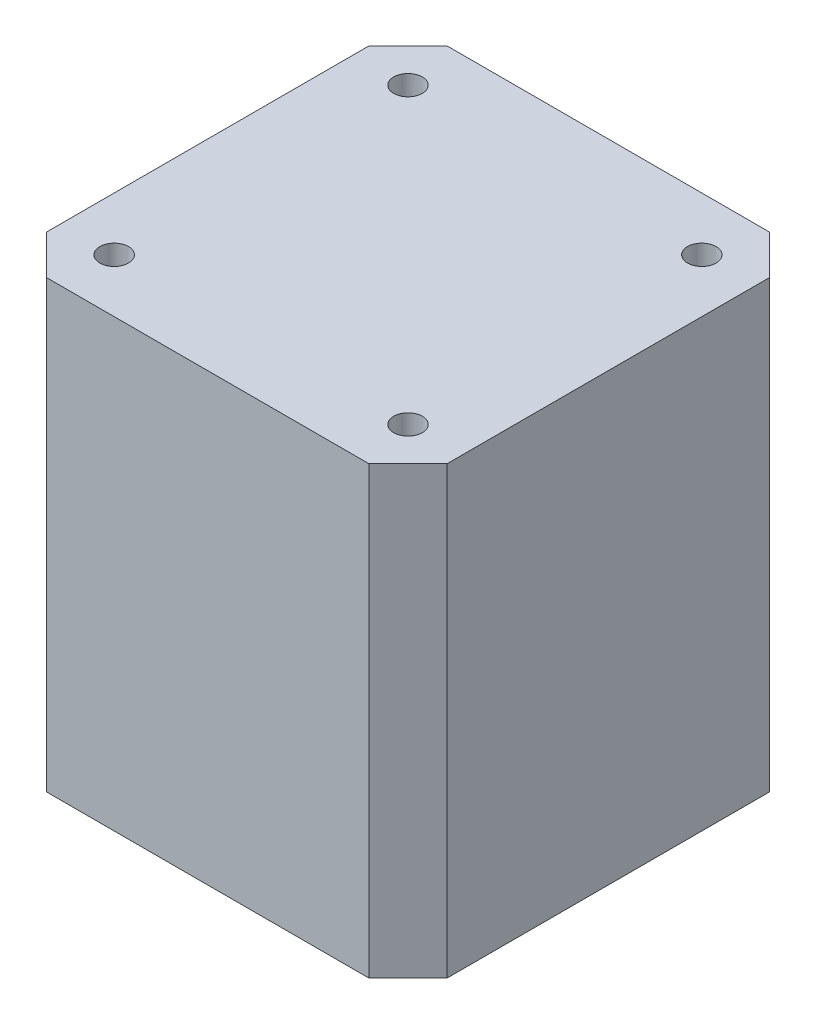
ISO-10303-21;
HEADER;
FILE_DESCRIPTION(('STEP AP214'),'2;1');
FILE_NAME('part.step','',(''),(''),'','','');
FILE_SCHEMA(('AUTOMOTIVE_DESIGN { 1 0 10303 214 1 1 1 1 }'));
ENDSEC;
DATA;
#1=APPLICATION_CONTEXT('core data for automotive mechanical design processes');
#2=APPLICATION_PROTOCOL_DEFINITION('international standard','automotive_design',2000,#1);
#3=PRODUCT_CONTEXT('',#1,'mechanical');
#4=PRODUCT('Part','Part','',(#3));
#5=PRODUCT_RELATED_PRODUCT_CATEGORY('part','',(#4));
#6=PRODUCT_DEFINITION_FORMATION('','',#4);
#7=PRODUCT_DEFINITION_CONTEXT('part definition',#1,'design');
#8=PRODUCT_DEFINITION('design','',#6,#7);
#9=PRODUCT_DEFINITION_SHAPE('','',#8);
#10=(LENGTH_UNIT() NAMED_UNIT(*) SI_UNIT(.MILLI.,.METRE.));
#11=(NAMED_UNIT(*) PLANE_ANGLE_UNIT() SI_UNIT($,.RADIAN.));
#12=(NAMED_UNIT(*) SI_UNIT($,.STERADIAN.) SOLID_ANGLE_UNIT());
#13=UNCERTAINTY_MEASURE_WITH_UNIT(LENGTH_MEASURE(1.E-05),#10,'distance_accuracy_value','');
#14=(GEOMETRIC_REPRESENTATION_CONTEXT(3) GLOBAL_UNCERTAINTY_ASSIGNED_CONTEXT((#13)) GLOBAL_UNIT_ASSIGNED_CONTEXT((#10,
#11,#12)) REPRESENTATION_CONTEXT('',''));
#15=CARTESIAN_POINT('',(0.,0.,0.));
#16=DIRECTION('',(0.,0.,1.));
#17=DIRECTION('',(1.,0.,0.));
#18=AXIS2_PLACEMENT_3D('',#15,#16,#17);
#19=CARTESIAN_POINT('',(0.,47.,0.));
#20=DIRECTION('',(0.,-1.,0.));
#21=DIRECTION('',(0.,0.,-1.));
#22=AXIS2_PLACEMENT_3D('',#19,#20,#21);
#23=PLANE('',#22);
#24=DIRECTION('',(0.707106781186548,0.,0.707106781186548));
#25=VECTOR('',#24,1.);
#26=CARTESIAN_POINT('',(-21.1500000000002,47.,17.0100000000009));
#27=LINE('',#26,#25);
#28=CARTESIAN_POINT('',(-21.1500000000002,47.,17.0100000000009));
#29=VERTEX_POINT('',#28);
#30=CARTESIAN_POINT('',(-17.0099999999998,47.,21.1500000000013));
#31=VERTEX_POINT('',#30);
#32=EDGE_CURVE('E146',#29,#31,#27,.T.);
#33=ORIENTED_EDGE('',*,*,#32,.T.);
#34=DIRECTION('',(1.,0.,0.));
#35=VECTOR('',#34,1.);
#36=CARTESIAN_POINT('',(-17.0099999999998,47.,21.1500000000013));
#37=LINE('',#36,#35);
#38=CARTESIAN_POINT('',(17.0099999999998,47.,21.1500000000013));
#39=VERTEX_POINT('',#38);
#40=EDGE_CURVE('E94',#31,#39,#37,.T.);
#41=ORIENTED_EDGE('',*,*,#40,.T.);
#42=DIRECTION('',(0.707106781186547,0.,-0.707106781186547));
#43=VECTOR('',#42,1.);
#44=CARTESIAN_POINT('',(21.1500000000002,47.,17.0100000000009));
#45=LINE('',#44,#43);
#46=CARTESIAN_POINT('',(21.1500000000002,47.,17.0100000000009));
#47=VERTEX_POINT('',#46);
#48=EDGE_CURVE('E225',#39,#47,#45,.T.);
#49=ORIENTED_EDGE('',*,*,#48,.T.);
#50=DIRECTION('',(0.,0.,-1.));
#51=VECTOR('',#50,1.);
#52=CARTESIAN_POINT('',(21.1500000000002,47.,17.0100000000009));
#53=LINE('',#52,#51);
#54=CARTESIAN_POINT('',(21.1500000000002,47.,-17.0099999999987));
#55=VERTEX_POINT('',#54);
#56=EDGE_CURVE('E227',#47,#55,#53,.T.);
#57=ORIENTED_EDGE('',*,*,#56,.T.);
#58=DIRECTION('',(-0.707106781186547,0.,-0.707106781186548));
#59=VECTOR('',#58,1.);
#60=CARTESIAN_POINT('',(17.0099999999998,47.,-21.1499999999992));
#61=LINE('',#60,#59);
#62=CARTESIAN_POINT('',(17.0099999999998,47.,-21.1499999999992));
#63=VERTEX_POINT('',#62);
#64=EDGE_CURVE('E113',#55,#63,#61,.T.);
#65=ORIENTED_EDGE('',*,*,#64,.T.);
#66=DIRECTION('',(-1.,0.,0.));
#67=VECTOR('',#66,1.);
#68=CARTESIAN_POINT('',(-17.01,47.,-21.1499999999992));
#69=LINE('',#68,#67);
#70=CARTESIAN_POINT('',(-17.01,47.,-21.1499999999992));
#71=VERTEX_POINT('',#70);
#72=EDGE_CURVE('E107',#63,#71,#69,.T.);
#73=ORIENTED_EDGE('',*,*,#72,.T.);
#74=DIRECTION('',(-0.707106781186566,0.,0.707106781186529));
#75=VECTOR('',#74,1.);
#76=CARTESIAN_POINT('',(-17.01,47.,-21.1499999999992));
#77=LINE('',#76,#75);
#78=CARTESIAN_POINT('',(-21.1500000000002,47.,-17.0099999999991));
#79=VERTEX_POINT('',#78);
#80=EDGE_CURVE('E111',#71,#79,#77,.T.);
#81=ORIENTED_EDGE('',*,*,#80,.T.);
#82=DIRECTION('',(0.,0.,1.));
#83=VECTOR('',#82,1.);
#84=CARTESIAN_POINT('',(-21.1500000000002,47.,17.0100000000009));
#85=LINE('',#84,#83);
#86=EDGE_CURVE('E50',#79,#29,#85,.T.);
#87=ORIENTED_EDGE('',*,*,#86,.T.);
#88=EDGE_LOOP('',(#33,#41,#49,#57,#65,#73,#81,#87));
#89=FACE_BOUND('',#88,.T.);
#90=CARTESIAN_POINT('',(15.5,47.,-15.5));
#91=DIRECTION('',(0.,1.,0.));
#92=DIRECTION('',(0.,0.,1.));
#93=AXIS2_PLACEMENT_3D('',#90,#91,#92);
#94=CIRCLE('',#93,1.51);
#95=CARTESIAN_POINT('',(15.5,47.,-13.99));
#96=VERTEX_POINT('',#95);
#97=EDGE_CURVE('E135',#96,#96,#94,.T.);
#98=ORIENTED_EDGE('',*,*,#97,.F.);
#99=EDGE_LOOP('',(#98));
#100=FACE_BOUND('',#99,.T.);
#101=CARTESIAN_POINT('',(15.5000000000009,47.,15.5));
#102=DIRECTION('',(0.,1.,0.));
#103=DIRECTION('',(0.,0.,1.));
#104=AXIS2_PLACEMENT_3D('',#101,#102,#103);
#105=CIRCLE('',#104,1.50999999999979);
#106=CARTESIAN_POINT('',(15.5000000000009,47.,17.0099999999998));
#107=VERTEX_POINT('',#106);
#108=EDGE_CURVE('E236',#107,#107,#105,.T.);
#109=ORIENTED_EDGE('',*,*,#108,.F.);
#110=EDGE_LOOP('',(#109));
#111=FACE_BOUND('',#110,.T.);
#112=CARTESIAN_POINT('',(-15.4999999999991,47.,15.5000000000009));
#113=DIRECTION('',(0.,1.,0.));
#114=DIRECTION('',(0.,0.,1.));
#115=AXIS2_PLACEMENT_3D('',#112,#113,#114);
#116=CIRCLE('',#115,1.51000000000065);
#117=CARTESIAN_POINT('',(-15.4999999999991,47.,17.0100000000015));
#118=VERTEX_POINT('',#117);
#119=EDGE_CURVE('E242',#118,#118,#116,.T.);
#120=ORIENTED_EDGE('',*,*,#119,.F.);
#121=EDGE_LOOP('',(#120));
#122=FACE_BOUND('',#121,.T.);
#123=CARTESIAN_POINT('',(-15.5,47.,-15.4999999999991));
#124=DIRECTION('',(0.,1.,0.));
#125=DIRECTION('',(0.,0.,1.));
#126=AXIS2_PLACEMENT_3D('',#123,#124,#125);
#127=CIRCLE('',#126,1.51000000000094);
#128=CARTESIAN_POINT('',(-15.5,47.,-13.9899999999982));
#129=VERTEX_POINT('',#128);
#130=EDGE_CURVE('E248',#129,#129,#127,.T.);
#131=ORIENTED_EDGE('',*,*,#130,.F.);
#132=EDGE_LOOP('',(#131));
#133=FACE_BOUND('',#132,.T.);
#134=ADVANCED_FACE('F33',(#89,#100,#111,#122,#133),#23,.F.);
#135=CARTESIAN_POINT('',(0.,0.,0.));
#136=DIRECTION('',(0.,-1.,0.));
#137=DIRECTION('',(0.,0.,-1.));
#138=AXIS2_PLACEMENT_3D('',#135,#136,#137);
#139=PLANE('',#138);
#140=CARTESIAN_POINT('',(0.,0.,0.));
#141=DIRECTION('',(0.,-1.,0.));
#142=DIRECTION('',(0.,0.,-1.));
#143=AXIS2_PLACEMENT_3D('',#140,#141,#142);
#144=CIRCLE('',#143,2.475);
#145=CARTESIAN_POINT('',(0.,0.,-2.475));
#146=VERTEX_POINT('',#145);
#147=EDGE_CURVE('E161',#146,#146,#144,.T.);
#148=ORIENTED_EDGE('',*,*,#147,.F.);
#149=EDGE_LOOP('',(#148));
#150=FACE_BOUND('',#149,.T.);
#151=CARTESIAN_POINT('',(-15.4999999999991,0.,15.5000000000009));
#152=DIRECTION('',(0.,1.,0.));
#153=DIRECTION('',(0.,0.,1.));
#154=AXIS2_PLACEMENT_3D('',#151,#152,#153);
#155=CIRCLE('',#154,1.51000000000065);
#156=CARTESIAN_POINT('',(-15.4999999999991,0.,17.0100000000015));
#157=VERTEX_POINT('',#156);
#158=EDGE_CURVE('E245',#157,#157,#155,.T.);
#159=ORIENTED_EDGE('',*,*,#158,.T.);
#160=EDGE_LOOP('',(#159));
#161=FACE_BOUND('',#160,.T.);
#162=CARTESIAN_POINT('',(15.5,0.,-15.5));
#163=DIRECTION('',(0.,1.,0.));
#164=DIRECTION('',(0.,0.,1.));
#165=AXIS2_PLACEMENT_3D('',#162,#163,#164);
#166=CIRCLE('',#165,1.51);
#167=CARTESIAN_POINT('',(15.5,0.,-13.99));
#168=VERTEX_POINT('',#167);
#169=EDGE_CURVE('E233',#168,#168,#166,.T.);
#170=ORIENTED_EDGE('',*,*,#169,.T.);
#171=EDGE_LOOP('',(#170));
#172=FACE_BOUND('',#171,.T.);
#173=DIRECTION('',(0.707106781186548,0.,0.707106781186548));
#174=VECTOR('',#173,1.);
#175=CARTESIAN_POINT('',(-21.1500000000002,0.,17.0100000000009));
#176=LINE('',#175,#174);
#177=CARTESIAN_POINT('',(-21.1500000000002,0.,17.0100000000009));
#178=VERTEX_POINT('',#177);
#179=CARTESIAN_POINT('',(-17.0099999999998,0.,21.1500000000013));
#180=VERTEX_POINT('',#179);
#181=EDGE_CURVE('E131',#178,#180,#176,.T.);
#182=ORIENTED_EDGE('',*,*,#181,.F.);
#183=DIRECTION('',(0.,0.,1.));
#184=VECTOR('',#183,1.);
#185=CARTESIAN_POINT('',(-21.1500000000002,0.,17.0100000000009));
#186=LINE('',#185,#184);
#187=CARTESIAN_POINT('',(-21.1500000000002,0.,-17.0099999999991));
#188=VERTEX_POINT('',#187);
#189=EDGE_CURVE('E85',#188,#178,#186,.T.);
#190=ORIENTED_EDGE('',*,*,#189,.F.);
#191=DIRECTION('',(-0.707106781186566,0.,0.707106781186529));
#192=VECTOR('',#191,1.);
#193=CARTESIAN_POINT('',(-17.01,0.,-21.1499999999992));
#194=LINE('',#193,#192);
#195=CARTESIAN_POINT('',(-17.01,0.,-21.1499999999992));
#196=VERTEX_POINT('',#195);
#197=EDGE_CURVE('E79',#196,#188,#194,.T.);
#198=ORIENTED_EDGE('',*,*,#197,.F.);
#199=DIRECTION('',(-1.,0.,0.));
#200=VECTOR('',#199,1.);
#201=CARTESIAN_POINT('',(-17.01,0.,-21.1499999999992));
#202=LINE('',#201,#200);
#203=CARTESIAN_POINT('',(17.0099999999998,0.,-21.1499999999992));
#204=VERTEX_POINT('',#203);
#205=EDGE_CURVE('E121',#204,#196,#202,.T.);
#206=ORIENTED_EDGE('',*,*,#205,.F.);
#207=DIRECTION('',(-0.707106781186547,0.,-0.707106781186548));
#208=VECTOR('',#207,1.);
#209=CARTESIAN_POINT('',(17.0099999999998,0.,-21.1499999999992));
#210=LINE('',#209,#208);
#211=CARTESIAN_POINT('',(21.1500000000002,0.,-17.0099999999987));
#212=VERTEX_POINT('',#211);
#213=EDGE_CURVE('E141',#212,#204,#210,.T.);
#214=ORIENTED_EDGE('',*,*,#213,.F.);
#215=DIRECTION('',(0.,0.,-1.));
#216=VECTOR('',#215,1.);
#217=CARTESIAN_POINT('',(21.1500000000002,0.,17.0100000000009));
#218=LINE('',#217,#216);
#219=CARTESIAN_POINT('',(21.1500000000002,0.,17.0100000000009));
#220=VERTEX_POINT('',#219);
#221=EDGE_CURVE('E139',#220,#212,#218,.T.);
#222=ORIENTED_EDGE('',*,*,#221,.F.);
#223=DIRECTION('',(0.707106781186547,0.,-0.707106781186547));
#224=VECTOR('',#223,1.);
#225=CARTESIAN_POINT('',(21.1500000000002,0.,17.0100000000009));
#226=LINE('',#225,#224);
#227=CARTESIAN_POINT('',(17.0099999999998,0.,21.1500000000013));
#228=VERTEX_POINT('',#227);
#229=EDGE_CURVE('E137',#228,#220,#226,.T.);
#230=ORIENTED_EDGE('',*,*,#229,.F.);
#231=DIRECTION('',(1.,0.,0.));
#232=VECTOR('',#231,1.);
#233=CARTESIAN_POINT('',(-17.0099999999998,0.,21.1500000000013));
#234=LINE('',#233,#232);
#235=EDGE_CURVE('E134',#180,#228,#234,.T.);
#236=ORIENTED_EDGE('',*,*,#235,.F.);
#237=EDGE_LOOP('',(#182,#190,#198,#206,#214,#222,#230,#236));
#238=FACE_BOUND('',#237,.T.);
#239=CARTESIAN_POINT('',(15.5000000000009,0.,15.5));
#240=DIRECTION('',(0.,1.,0.));
#241=DIRECTION('',(0.,0.,1.));
#242=AXIS2_PLACEMENT_3D('',#239,#240,#241);
#243=CIRCLE('',#242,1.50999999999979);
#244=CARTESIAN_POINT('',(15.5000000000009,0.,17.0099999999998));
#245=VERTEX_POINT('',#244);
#246=EDGE_CURVE('E239',#245,#245,#243,.T.);
#247=ORIENTED_EDGE('',*,*,#246,.T.);
#248=EDGE_LOOP('',(#247));
#249=FACE_BOUND('',#248,.T.);
#250=CARTESIAN_POINT('',(-15.5,0.,-15.4999999999991));
#251=DIRECTION('',(0.,1.,0.));
#252=DIRECTION('',(0.,0.,1.));
#253=AXIS2_PLACEMENT_3D('',#250,#251,#252);
#254=CIRCLE('',#253,1.51000000000094);
#255=CARTESIAN_POINT('',(-15.5,0.,-13.9899999999982));
#256=VERTEX_POINT('',#255);
#257=EDGE_CURVE('E251',#256,#256,#254,.T.);
#258=ORIENTED_EDGE('',*,*,#257,.T.);
#259=EDGE_LOOP('',(#258));
#260=FACE_BOUND('',#259,.T.);
#261=ADVANCED_FACE('F179',(#150,#161,#172,#238,#249,#260),#139,.T.);
#262=CARTESIAN_POINT('',(-21.1500000000002,47.,17.0100000000009));
#263=DIRECTION('',(0.707106781186547,0.,-0.707106781186547));
#264=DIRECTION('',(-0.707106781186548,0.,-0.707106781186548));
#265=AXIS2_PLACEMENT_3D('',#262,#263,#264);
#266=PLANE('',#265);
#267=ORIENTED_EDGE('',*,*,#181,.T.);
#268=DIRECTION('',(0.,-1.,0.));
#269=VECTOR('',#268,1.);
#270=CARTESIAN_POINT('',(-17.0099999999998,47.,21.1500000000013));
#271=LINE('',#270,#269);
#272=EDGE_CURVE('E159',#31,#180,#271,.T.);
#273=ORIENTED_EDGE('',*,*,#272,.F.);
#274=ORIENTED_EDGE('',*,*,#32,.F.);
#275=DIRECTION('',(0.,-1.,0.));
#276=VECTOR('',#275,1.);
#277=CARTESIAN_POINT('',(-21.1500000000002,47.,17.0100000000009));
#278=LINE('',#277,#276);
#279=EDGE_CURVE('E127',#29,#178,#278,.T.);
#280=ORIENTED_EDGE('',*,*,#279,.T.);
#281=EDGE_LOOP('',(#267,#273,#274,#280));
#282=FACE_BOUND('',#281,.T.);
#283=ADVANCED_FACE('F184',(#282),#266,.F.);
#284=CARTESIAN_POINT('',(-17.0099999999998,47.,21.1500000000013));
#285=DIRECTION('',(0.,0.,-1.));
#286=DIRECTION('',(-1.,0.,0.));
#287=AXIS2_PLACEMENT_3D('',#284,#285,#286);
#288=PLANE('',#287);
#289=ORIENTED_EDGE('',*,*,#235,.T.);
#290=DIRECTION('',(0.,-1.,0.));
#291=VECTOR('',#290,1.);
#292=CARTESIAN_POINT('',(17.0099999999998,47.,21.1500000000013));
#293=LINE('',#292,#291);
#294=EDGE_CURVE('E156',#39,#228,#293,.T.);
#295=ORIENTED_EDGE('',*,*,#294,.F.);
#296=ORIENTED_EDGE('',*,*,#40,.F.);
#297=ORIENTED_EDGE('',*,*,#272,.T.);
#298=EDGE_LOOP('',(#289,#295,#296,#297));
#299=FACE_BOUND('',#298,.T.);
#300=ADVANCED_FACE('F209',(#299),#288,.F.);
#301=CARTESIAN_POINT('',(21.1500000000002,47.,17.0100000000009));
#302=DIRECTION('',(-0.707106781186547,0.,-0.707106781186547));
#303=DIRECTION('',(-0.707106781186548,0.,0.707106781186548));
#304=AXIS2_PLACEMENT_3D('',#301,#302,#303);
#305=PLANE('',#304);
#306=ORIENTED_EDGE('',*,*,#229,.T.);
#307=DIRECTION('',(0.,-1.,0.));
#308=VECTOR('',#307,1.);
#309=CARTESIAN_POINT('',(21.1500000000002,47.,17.0100000000009));
#310=LINE('',#309,#308);
#311=EDGE_CURVE('E153',#47,#220,#310,.T.);
#312=ORIENTED_EDGE('',*,*,#311,.F.);
#313=ORIENTED_EDGE('',*,*,#48,.F.);
#314=ORIENTED_EDGE('',*,*,#294,.T.);
#315=EDGE_LOOP('',(#306,#312,#313,#314));
#316=FACE_BOUND('',#315,.T.);
#317=ADVANCED_FACE('F205',(#316),#305,.F.);
#318=CARTESIAN_POINT('',(21.1500000000002,47.,17.0100000000009));
#319=DIRECTION('',(-1.,0.,0.));
#320=DIRECTION('',(0.,0.,1.));
#321=AXIS2_PLACEMENT_3D('',#318,#319,#320);
#322=PLANE('',#321);
#323=ORIENTED_EDGE('',*,*,#221,.T.);
#324=DIRECTION('',(0.,-1.,0.));
#325=VECTOR('',#324,1.);
#326=CARTESIAN_POINT('',(21.1500000000002,47.,-17.0099999999987));
#327=LINE('',#326,#325);
#328=EDGE_CURVE('E150',#55,#212,#327,.T.);
#329=ORIENTED_EDGE('',*,*,#328,.F.);
#330=ORIENTED_EDGE('',*,*,#56,.F.);
#331=ORIENTED_EDGE('',*,*,#311,.T.);
#332=EDGE_LOOP('',(#323,#329,#330,#331));
#333=FACE_BOUND('',#332,.T.);
#334=ADVANCED_FACE('F201',(#333),#322,.F.);
#335=CARTESIAN_POINT('',(17.0099999999998,47.,-21.1499999999992));
#336=DIRECTION('',(-0.707106781186548,0.,0.707106781186547));
#337=DIRECTION('',(0.707106781186547,0.,0.707106781186548));
#338=AXIS2_PLACEMENT_3D('',#335,#336,#337);
#339=PLANE('',#338);
#340=ORIENTED_EDGE('',*,*,#213,.T.);
#341=DIRECTION('',(0.,-1.,0.));
#342=VECTOR('',#341,1.);
#343=CARTESIAN_POINT('',(17.0099999999998,47.,-21.1499999999992));
#344=LINE('',#343,#342);
#345=EDGE_CURVE('E122',#63,#204,#344,.T.);
#346=ORIENTED_EDGE('',*,*,#345,.F.);
#347=ORIENTED_EDGE('',*,*,#64,.F.);
#348=ORIENTED_EDGE('',*,*,#328,.T.);
#349=EDGE_LOOP('',(#340,#346,#347,#348));
#350=FACE_BOUND('',#349,.T.);
#351=ADVANCED_FACE('F198',(#350),#339,.F.);
#352=CARTESIAN_POINT('',(-17.01,47.,-21.1499999999992));
#353=DIRECTION('',(0.,0.,1.));
#354=DIRECTION('',(1.,0.,0.));
#355=AXIS2_PLACEMENT_3D('',#352,#353,#354);
#356=PLANE('',#355);
#357=ORIENTED_EDGE('',*,*,#205,.T.);
#358=DIRECTION('',(0.,-1.,0.));
#359=VECTOR('',#358,1.);
#360=CARTESIAN_POINT('',(-17.01,47.,-21.1499999999992));
#361=LINE('',#360,#359);
#362=EDGE_CURVE('E118',#71,#196,#361,.T.);
#363=ORIENTED_EDGE('',*,*,#362,.F.);
#364=ORIENTED_EDGE('',*,*,#72,.F.);
#365=ORIENTED_EDGE('',*,*,#345,.T.);
#366=EDGE_LOOP('',(#357,#363,#364,#365));
#367=FACE_BOUND('',#366,.T.);
#368=ADVANCED_FACE('F119',(#367),#356,.F.);
#369=CARTESIAN_POINT('',(-17.01,47.,-21.1499999999992));
#370=DIRECTION('',(0.707106781186529,0.,0.707106781186566));
#371=DIRECTION('',(0.707106781186566,0.,-0.707106781186529));
#372=AXIS2_PLACEMENT_3D('',#369,#370,#371);
#373=PLANE('',#372);
#374=ORIENTED_EDGE('',*,*,#197,.T.);
#375=DIRECTION('',(0.,-1.,0.));
#376=VECTOR('',#375,1.);
#377=CARTESIAN_POINT('',(-21.1500000000002,47.,-17.0099999999991));
#378=LINE('',#377,#376);
#379=EDGE_CURVE('E123',#79,#188,#378,.T.);
#380=ORIENTED_EDGE('',*,*,#379,.F.);
#381=ORIENTED_EDGE('',*,*,#80,.F.);
#382=ORIENTED_EDGE('',*,*,#362,.T.);
#383=EDGE_LOOP('',(#374,#380,#381,#382));
#384=FACE_BOUND('',#383,.T.);
#385=ADVANCED_FACE('F125',(#384),#373,.F.);
#386=CARTESIAN_POINT('',(-21.1500000000002,47.,17.0100000000009));
#387=DIRECTION('',(1.,0.,0.));
#388=DIRECTION('',(0.,0.,-1.));
#389=AXIS2_PLACEMENT_3D('',#386,#387,#388);
#390=PLANE('',#389);
#391=ORIENTED_EDGE('',*,*,#189,.T.);
#392=ORIENTED_EDGE('',*,*,#279,.F.);
#393=ORIENTED_EDGE('',*,*,#86,.F.);
#394=ORIENTED_EDGE('',*,*,#379,.T.);
#395=EDGE_LOOP('',(#391,#392,#393,#394));
#396=FACE_BOUND('',#395,.T.);
#397=ADVANCED_FACE('F191',(#396),#390,.F.);
#398=CARTESIAN_POINT('',(15.5,47.,-15.5));
#399=DIRECTION('',(0.,-1.,0.));
#400=DIRECTION('',(0.,0.,-1.));
#401=AXIS2_PLACEMENT_3D('',#398,#399,#400);
#402=CYLINDRICAL_SURFACE('',#401,1.51);
#403=ORIENTED_EDGE('',*,*,#97,.T.);
#404=EDGE_LOOP('',(#403));
#405=FACE_BOUND('',#404,.T.);
#406=ORIENTED_EDGE('',*,*,#169,.F.);
#407=EDGE_LOOP('',(#406));
#408=FACE_BOUND('',#407,.T.);
#409=ADVANCED_FACE('F188',(#405,#408),#402,.F.);
#410=CARTESIAN_POINT('',(15.5000000000009,47.,15.5));
#411=DIRECTION('',(0.,-1.,0.));
#412=DIRECTION('',(0.,0.,-1.));
#413=AXIS2_PLACEMENT_3D('',#410,#411,#412);
#414=CYLINDRICAL_SURFACE('',#413,1.50999999999979);
#415=ORIENTED_EDGE('',*,*,#108,.T.);
#416=EDGE_LOOP('',(#415));
#417=FACE_BOUND('',#416,.T.);
#418=ORIENTED_EDGE('',*,*,#246,.F.);
#419=EDGE_LOOP('',(#418));
#420=FACE_BOUND('',#419,.T.);
#421=ADVANCED_FACE('F270',(#417,#420),#414,.F.);
#422=CARTESIAN_POINT('',(-15.4999999999991,47.,15.5000000000009));
#423=DIRECTION('',(0.,-1.,0.));
#424=DIRECTION('',(0.,0.,-1.));
#425=AXIS2_PLACEMENT_3D('',#422,#423,#424);
#426=CYLINDRICAL_SURFACE('',#425,1.51000000000065);
#427=ORIENTED_EDGE('',*,*,#119,.T.);
#428=EDGE_LOOP('',(#427));
#429=FACE_BOUND('',#428,.T.);
#430=ORIENTED_EDGE('',*,*,#158,.F.);
#431=EDGE_LOOP('',(#430));
#432=FACE_BOUND('',#431,.T.);
#433=ADVANCED_FACE('F261',(#429,#432),#426,.F.);
#434=CARTESIAN_POINT('',(-15.5,47.,-15.4999999999991));
#435=DIRECTION('',(0.,-1.,0.));
#436=DIRECTION('',(0.,0.,-1.));
#437=AXIS2_PLACEMENT_3D('',#434,#435,#436);
#438=CYLINDRICAL_SURFACE('',#437,1.51000000000094);
#439=ORIENTED_EDGE('',*,*,#130,.T.);
#440=EDGE_LOOP('',(#439));
#441=FACE_BOUND('',#440,.T.);
#442=ORIENTED_EDGE('',*,*,#257,.F.);
#443=EDGE_LOOP('',(#442));
#444=FACE_BOUND('',#443,.T.);
#445=ADVANCED_FACE('F257',(#441,#444),#438,.F.);
#446=CARTESIAN_POINT('',(0.,-10.,0.));
#447=DIRECTION('',(0.,1.,0.));
#448=DIRECTION('',(0.,0.,1.));
#449=AXIS2_PLACEMENT_3D('',#446,#447,#448);
#450=CYLINDRICAL_SURFACE('',#449,2.475);
#451=CARTESIAN_POINT('',(0.,-9.7,0.));
#452=DIRECTION('',(0.,1.,0.));
#453=DIRECTION('',(0.,0.,1.));
#454=AXIS2_PLACEMENT_3D('',#451,#452,#453);
#455=CIRCLE('',#454,2.475);
#456=CARTESIAN_POINT('',(0.,-9.7,2.475));
#457=VERTEX_POINT('',#456);
#458=EDGE_CURVE('E42',#457,#457,#455,.T.);
#459=ORIENTED_EDGE('',*,*,#458,.T.);
#460=EDGE_LOOP('',(#459));
#461=FACE_BOUND('',#460,.T.);
#462=ORIENTED_EDGE('',*,*,#147,.T.);
#463=EDGE_LOOP('',(#462));
#464=FACE_BOUND('',#463,.T.);
#465=ADVANCED_FACE('F166',(#461,#464),#450,.T.);
#466=CARTESIAN_POINT('',(0.,-10.,0.));
#467=DIRECTION('',(0.,1.,0.));
#468=DIRECTION('',(0.,0.,1.));
#469=AXIS2_PLACEMENT_3D('',#466,#467,#468);
#470=PLANE('',#469);
#471=CARTESIAN_POINT('',(0.,-10.,0.));
#472=DIRECTION('',(0.,1.,0.));
#473=DIRECTION('',(0.,0.,1.));
#474=AXIS2_PLACEMENT_3D('',#471,#472,#473);
#475=CIRCLE('',#474,2.175);
#476=CARTESIAN_POINT('',(0.,-10.,2.175));
#477=VERTEX_POINT('',#476);
#478=EDGE_CURVE('E11',#477,#477,#475,.F.);
#479=ORIENTED_EDGE('',*,*,#478,.T.);
#480=EDGE_LOOP('',(#479));
#481=FACE_BOUND('',#480,.T.);
#482=ADVANCED_FACE('F170',(#481),#470,.F.);
#483=CARTESIAN_POINT('',(0.,-9.7,0.));
#484=DIRECTION('',(0.,1.,0.));
#485=DIRECTION('',(0.,0.,1.));
#486=AXIS2_PLACEMENT_3D('',#483,#484,#485);
#487=TOROIDAL_SURFACE('',#486,2.175,0.3);
#488=ORIENTED_EDGE('',*,*,#478,.F.);
#489=EDGE_LOOP('',(#488));
#490=FACE_BOUND('',#489,.T.);
#491=ORIENTED_EDGE('',*,*,#458,.F.);
#492=EDGE_LOOP('',(#491));
#493=FACE_BOUND('',#492,.T.);
#494=ADVANCED_FACE('F35',(#490,#493),#487,.T.);
#495=CLOSED_SHELL('',(#134,#261,#283,#300,#317,#334,#351,#368,#385,#397,#409,#421,#433,#445,
#465,#482,#494));
#496=MANIFOLD_SOLID_BREP('B2',#495);
#497=ADVANCED_BREP_SHAPE_REPRESENTATION('',(#18,#496),#14);
#498=SHAPE_DEFINITION_REPRESENTATION(#9,#497);
ENDSEC;
END-ISO-10303-21;
